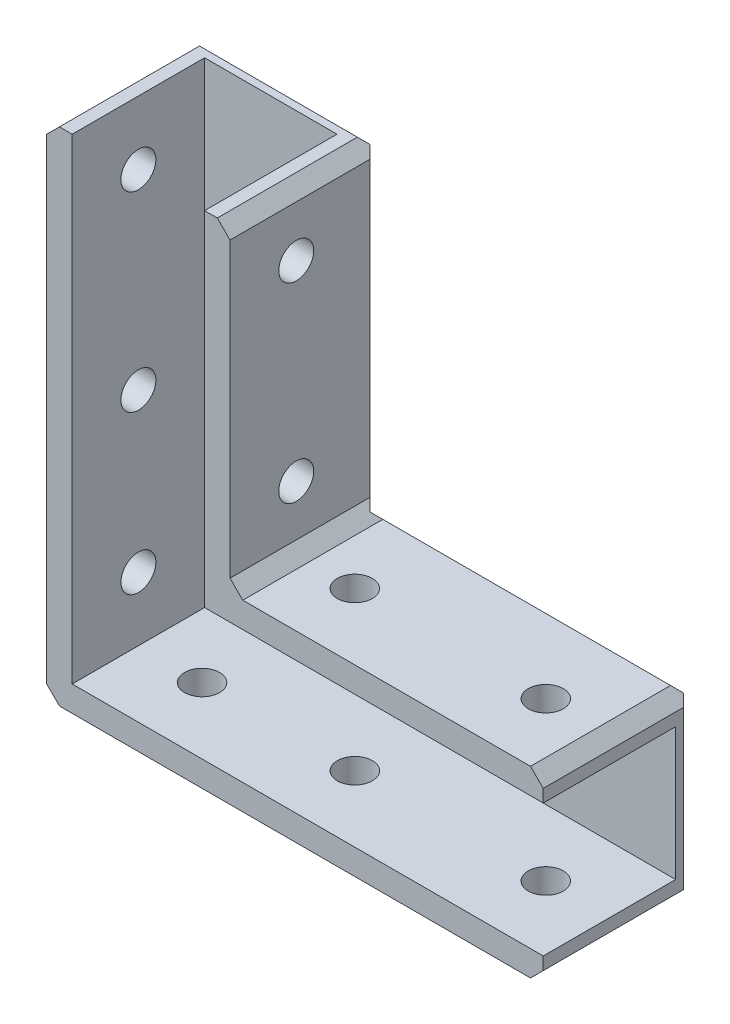
ISO-10303-21;
HEADER;
FILE_DESCRIPTION(('STEP AP214'),'2;1');
FILE_NAME('part.step','',(''),(''),'','','');
FILE_SCHEMA(('AUTOMOTIVE_DESIGN { 1 0 10303 214 1 1 1 1 }'));
ENDSEC;
DATA;
#1=APPLICATION_CONTEXT('core data for automotive mechanical design processes');
#2=APPLICATION_PROTOCOL_DEFINITION('international standard','automotive_design',2000,#1);
#3=PRODUCT_CONTEXT('',#1,'mechanical');
#4=PRODUCT('Part','Part','',(#3));
#5=PRODUCT_RELATED_PRODUCT_CATEGORY('part','',(#4));
#6=PRODUCT_DEFINITION_FORMATION('','',#4);
#7=PRODUCT_DEFINITION_CONTEXT('part definition',#1,'design');
#8=PRODUCT_DEFINITION('design','',#6,#7);
#9=PRODUCT_DEFINITION_SHAPE('','',#8);
#10=(LENGTH_UNIT() NAMED_UNIT(*) SI_UNIT(.MILLI.,.METRE.));
#11=(NAMED_UNIT(*) PLANE_ANGLE_UNIT() SI_UNIT($,.RADIAN.));
#12=(NAMED_UNIT(*) SI_UNIT($,.STERADIAN.) SOLID_ANGLE_UNIT());
#13=UNCERTAINTY_MEASURE_WITH_UNIT(LENGTH_MEASURE(1.E-05),#10,'distance_accuracy_value','');
#14=(GEOMETRIC_REPRESENTATION_CONTEXT(3) GLOBAL_UNCERTAINTY_ASSIGNED_CONTEXT((#13)) GLOBAL_UNIT_ASSIGNED_CONTEXT((#10,
#11,#12)) REPRESENTATION_CONTEXT('',''));
#15=CARTESIAN_POINT('',(0.,0.,0.));
#16=DIRECTION('',(0.,0.,1.));
#17=DIRECTION('',(1.,0.,0.));
#18=AXIS2_PLACEMENT_3D('',#15,#16,#17);
#19=CARTESIAN_POINT('',(0.,0.,24.));
#20=DIRECTION('',(0.,0.,1.));
#21=DIRECTION('',(1.,0.,0.));
#22=AXIS2_PLACEMENT_3D('',#19,#20,#21);
#23=PLANE('',#22);
#24=DIRECTION('',(0.,1.,0.));
#25=VECTOR('',#24,1.);
#26=CARTESIAN_POINT('',(28.8,0.,24.));
#27=LINE('',#26,#25);
#28=CARTESIAN_POINT('',(28.8,30.8,24.));
#29=VERTEX_POINT('',#28);
#30=CARTESIAN_POINT('',(28.8,76.8,24.));
#31=VERTEX_POINT('',#30);
#32=EDGE_CURVE('E247',#29,#31,#27,.T.);
#33=ORIENTED_EDGE('',*,*,#32,.T.);
#34=DIRECTION('',(-0.707106781186548,0.707106781186548,0.));
#35=VECTOR('',#34,1.);
#36=CARTESIAN_POINT('',(52.8,52.8,24.));
#37=LINE('',#36,#35);
#38=CARTESIAN_POINT('',(26.8,78.8,24.));
#39=VERTEX_POINT('',#38);
#40=EDGE_CURVE('E361',#31,#39,#37,.T.);
#41=ORIENTED_EDGE('',*,*,#40,.T.);
#42=DIRECTION('',(1.,0.,0.));
#43=VECTOR('',#42,1.);
#44=CARTESIAN_POINT('',(0.,78.8,24.));
#45=LINE('',#44,#43);
#46=CARTESIAN_POINT('',(24.8,78.8,24.));
#47=VERTEX_POINT('',#46);
#48=EDGE_CURVE('E250',#47,#39,#45,.T.);
#49=ORIENTED_EDGE('',*,*,#48,.F.);
#50=DIRECTION('',(0.,1.,0.));
#51=VECTOR('',#50,1.);
#52=CARTESIAN_POINT('',(24.8,24.8,24.));
#53=LINE('',#52,#51);
#54=CARTESIAN_POINT('',(24.8,24.8,24.));
#55=VERTEX_POINT('',#54);
#56=EDGE_CURVE('E222',#55,#47,#53,.T.);
#57=ORIENTED_EDGE('',*,*,#56,.F.);
#58=DIRECTION('',(-1.,0.,0.));
#59=VECTOR('',#58,1.);
#60=CARTESIAN_POINT('',(78.,24.8,24.));
#61=LINE('',#60,#59);
#62=CARTESIAN_POINT('',(78.,24.8,24.));
#63=VERTEX_POINT('',#62);
#64=EDGE_CURVE('E458',#63,#55,#61,.T.);
#65=ORIENTED_EDGE('',*,*,#64,.F.);
#66=DIRECTION('',(0.,1.,0.));
#67=VECTOR('',#66,1.);
#68=CARTESIAN_POINT('',(78.,0.,24.));
#69=LINE('',#68,#67);
#70=CARTESIAN_POINT('',(78.,26.8,24.));
#71=VERTEX_POINT('',#70);
#72=EDGE_CURVE('E241',#63,#71,#69,.T.);
#73=ORIENTED_EDGE('',*,*,#72,.T.);
#74=DIRECTION('',(-0.707106781186545,0.70710678118655,0.));
#75=VECTOR('',#74,1.);
#76=CARTESIAN_POINT('',(52.4000000000003,52.3999999999999,24.));
#77=LINE('',#76,#75);
#78=CARTESIAN_POINT('',(76.,28.8,24.));
#79=VERTEX_POINT('',#78);
#80=EDGE_CURVE('E359',#71,#79,#77,.T.);
#81=ORIENTED_EDGE('',*,*,#80,.T.);
#82=DIRECTION('',(1.,0.,0.));
#83=VECTOR('',#82,1.);
#84=CARTESIAN_POINT('',(0.,28.8,24.));
#85=LINE('',#84,#83);
#86=CARTESIAN_POINT('',(30.8,28.8,24.));
#87=VERTEX_POINT('',#86);
#88=EDGE_CURVE('E244',#87,#79,#85,.T.);
#89=ORIENTED_EDGE('',*,*,#88,.F.);
#90=DIRECTION('',(-0.707106781186543,0.707106781186552,0.));
#91=VECTOR('',#90,1.);
#92=CARTESIAN_POINT('',(28.8,30.8,24.));
#93=LINE('',#92,#91);
#94=EDGE_CURVE('E11',#87,#29,#93,.T.);
#95=ORIENTED_EDGE('',*,*,#94,.T.);
#96=EDGE_LOOP('',(#33,#41,#49,#57,#65,#73,#81,#89,#95));
#97=FACE_BOUND('',#96,.T.);
#98=ADVANCED_FACE('F37',(#97),#23,.T.);
#99=CARTESIAN_POINT('',(0.,0.,24.));
#100=DIRECTION('',(-1.,0.,0.));
#101=DIRECTION('',(0.,0.,1.));
#102=AXIS2_PLACEMENT_3D('',#99,#100,#101);
#103=PLANE('',#102);
#104=CARTESIAN_POINT('',(0.,14.,13.6));
#105=DIRECTION('',(-1.,0.,0.));
#106=DIRECTION('',(0.,0.,1.));
#107=AXIS2_PLACEMENT_3D('',#104,#105,#106);
#108=CIRCLE('',#107,2.75);
#109=CARTESIAN_POINT('',(0.,14.,16.35));
#110=VERTEX_POINT('',#109);
#111=EDGE_CURVE('E276',#110,#110,#108,.T.);
#112=ORIENTED_EDGE('',*,*,#111,.F.);
#113=EDGE_LOOP('',(#112));
#114=FACE_BOUND('',#113,.T.);
#115=CARTESIAN_POINT('',(0.,68.8,13.6));
#116=DIRECTION('',(-1.,0.,0.));
#117=DIRECTION('',(0.,0.,1.));
#118=AXIS2_PLACEMENT_3D('',#115,#116,#117);
#119=CIRCLE('',#118,2.75);
#120=CARTESIAN_POINT('',(0.,68.8,16.35));
#121=VERTEX_POINT('',#120);
#122=EDGE_CURVE('E503',#121,#121,#119,.T.);
#123=ORIENTED_EDGE('',*,*,#122,.F.);
#124=EDGE_LOOP('',(#123));
#125=FACE_BOUND('',#124,.T.);
#126=CARTESIAN_POINT('',(0.,38.8,13.6));
#127=DIRECTION('',(-1.,0.,0.));
#128=DIRECTION('',(0.,0.,1.));
#129=AXIS2_PLACEMENT_3D('',#126,#127,#128);
#130=CIRCLE('',#129,2.75);
#131=CARTESIAN_POINT('',(0.,38.8,16.35));
#132=VERTEX_POINT('',#131);
#133=EDGE_CURVE('E496',#132,#132,#130,.T.);
#134=ORIENTED_EDGE('',*,*,#133,.F.);
#135=EDGE_LOOP('',(#134));
#136=FACE_BOUND('',#135,.T.);
#137=DIRECTION('',(0.,-1.,0.));
#138=VECTOR('',#137,1.);
#139=CARTESIAN_POINT('',(0.,0.,2.00000000000002));
#140=LINE('',#139,#138);
#141=CARTESIAN_POINT('',(0.,76.8,2.00000000000002));
#142=VERTEX_POINT('',#141);
#143=CARTESIAN_POINT('',(0.,2.00000000000002,2.00000000000002));
#144=VERTEX_POINT('',#143);
#145=EDGE_CURVE('E299',#142,#144,#140,.T.);
#146=ORIENTED_EDGE('',*,*,#145,.T.);
#147=DIRECTION('',(0.,0.,1.));
#148=VECTOR('',#147,1.);
#149=CARTESIAN_POINT('',(0.,2.00000000000002,24.));
#150=LINE('',#149,#148);
#151=CARTESIAN_POINT('',(0.,2.00000000000002,24.));
#152=VERTEX_POINT('',#151);
#153=EDGE_CURVE('E337',#144,#152,#150,.T.);
#154=ORIENTED_EDGE('',*,*,#153,.T.);
#155=DIRECTION('',(0.,1.,0.));
#156=VECTOR('',#155,1.);
#157=CARTESIAN_POINT('',(0.,0.,24.));
#158=LINE('',#157,#156);
#159=CARTESIAN_POINT('',(0.,76.8,24.));
#160=VERTEX_POINT('',#159);
#161=EDGE_CURVE('E234',#152,#160,#158,.T.);
#162=ORIENTED_EDGE('',*,*,#161,.T.);
#163=DIRECTION('',(0.,0.,-1.));
#164=VECTOR('',#163,1.);
#165=CARTESIAN_POINT('',(0.,76.8,24.));
#166=LINE('',#165,#164);
#167=EDGE_CURVE('E334',#160,#142,#166,.T.);
#168=ORIENTED_EDGE('',*,*,#167,.T.);
#169=EDGE_LOOP('',(#146,#154,#162,#168));
#170=FACE_BOUND('',#169,.T.);
#171=ADVANCED_FACE('F520',(#114,#125,#136,#170),#103,.T.);
#172=CARTESIAN_POINT('',(0.,0.,24.));
#173=DIRECTION('',(0.,1.,0.));
#174=DIRECTION('',(0.,0.,1.));
#175=AXIS2_PLACEMENT_3D('',#172,#173,#174);
#176=PLANE('',#175);
#177=CARTESIAN_POINT('',(14.,0.,13.6));
#178=DIRECTION('',(0.,-1.,0.));
#179=DIRECTION('',(0.,0.,-1.));
#180=AXIS2_PLACEMENT_3D('',#177,#178,#179);
#181=CIRCLE('',#180,2.75);
#182=CARTESIAN_POINT('',(14.,0.,10.85));
#183=VERTEX_POINT('',#182);
#184=EDGE_CURVE('E280',#183,#183,#181,.T.);
#185=ORIENTED_EDGE('',*,*,#184,.F.);
#186=EDGE_LOOP('',(#185));
#187=FACE_BOUND('',#186,.T.);
#188=CARTESIAN_POINT('',(38.,0.,13.6));
#189=DIRECTION('',(0.,1.,0.));
#190=DIRECTION('',(0.,0.,1.));
#191=AXIS2_PLACEMENT_3D('',#188,#189,#190);
#192=CIRCLE('',#191,2.74999999999999);
#193=CARTESIAN_POINT('',(38.,0.,16.35));
#194=VERTEX_POINT('',#193);
#195=EDGE_CURVE('E489',#194,#194,#192,.T.);
#196=ORIENTED_EDGE('',*,*,#195,.T.);
#197=EDGE_LOOP('',(#196));
#198=FACE_BOUND('',#197,.T.);
#199=CARTESIAN_POINT('',(68.,0.,13.6));
#200=DIRECTION('',(0.,1.,0.));
#201=DIRECTION('',(0.,0.,1.));
#202=AXIS2_PLACEMENT_3D('',#199,#200,#201);
#203=CIRCLE('',#202,2.75000000000001);
#204=CARTESIAN_POINT('',(68.,0.,16.35));
#205=VERTEX_POINT('',#204);
#206=EDGE_CURVE('E478',#205,#205,#203,.T.);
#207=ORIENTED_EDGE('',*,*,#206,.T.);
#208=EDGE_LOOP('',(#207));
#209=FACE_BOUND('',#208,.T.);
#210=DIRECTION('',(1.,0.,0.));
#211=VECTOR('',#210,1.);
#212=CARTESIAN_POINT('',(0.,0.,24.));
#213=LINE('',#212,#211);
#214=CARTESIAN_POINT('',(2.00000000000002,0.,24.));
#215=VERTEX_POINT('',#214);
#216=CARTESIAN_POINT('',(76.,0.,24.));
#217=VERTEX_POINT('',#216);
#218=EDGE_CURVE('E237',#215,#217,#213,.T.);
#219=ORIENTED_EDGE('',*,*,#218,.F.);
#220=DIRECTION('',(0.,0.,-1.));
#221=VECTOR('',#220,1.);
#222=CARTESIAN_POINT('',(2.00000000000002,0.,2.00000000000002));
#223=LINE('',#222,#221);
#224=CARTESIAN_POINT('',(2.00000000000002,0.,2.00000000000002));
#225=VERTEX_POINT('',#224);
#226=EDGE_CURVE('E319',#215,#225,#223,.T.);
#227=ORIENTED_EDGE('',*,*,#226,.T.);
#228=DIRECTION('',(1.,0.,0.));
#229=VECTOR('',#228,1.);
#230=CARTESIAN_POINT('',(0.,0.,2.00000000000002));
#231=LINE('',#230,#229);
#232=CARTESIAN_POINT('',(76.,0.,2.00000000000002));
#233=VERTEX_POINT('',#232);
#234=EDGE_CURVE('E296',#225,#233,#231,.T.);
#235=ORIENTED_EDGE('',*,*,#234,.T.);
#236=DIRECTION('',(0.,0.,1.));
#237=VECTOR('',#236,1.);
#238=CARTESIAN_POINT('',(76.,0.,24.));
#239=LINE('',#238,#237);
#240=EDGE_CURVE('E317',#233,#217,#239,.T.);
#241=ORIENTED_EDGE('',*,*,#240,.T.);
#242=EDGE_LOOP('',(#219,#227,#235,#241));
#243=FACE_BOUND('',#242,.T.);
#244=ADVANCED_FACE('F400',(#187,#198,#209,#243),#176,.F.);
#245=CARTESIAN_POINT('',(78.,0.,24.));
#246=DIRECTION('',(-1.,0.,0.));
#247=DIRECTION('',(0.,0.,1.));
#248=AXIS2_PLACEMENT_3D('',#245,#246,#247);
#249=PLANE('',#248);
#250=DIRECTION('',(0.,1.,0.));
#251=VECTOR('',#250,1.);
#252=CARTESIAN_POINT('',(78.,0.,2.00000000000002));
#253=LINE('',#252,#251);
#254=CARTESIAN_POINT('',(78.,2.00000000000002,2.00000000000002));
#255=VERTEX_POINT('',#254);
#256=CARTESIAN_POINT('',(78.,26.8,2.00000000000002));
#257=VERTEX_POINT('',#256);
#258=EDGE_CURVE('E62',#255,#257,#253,.T.);
#259=ORIENTED_EDGE('',*,*,#258,.T.);
#260=DIRECTION('',(0.,0.,1.));
#261=VECTOR('',#260,1.);
#262=CARTESIAN_POINT('',(78.,26.8,24.));
#263=LINE('',#262,#261);
#264=EDGE_CURVE('E370',#257,#71,#263,.T.);
#265=ORIENTED_EDGE('',*,*,#264,.T.);
#266=ORIENTED_EDGE('',*,*,#72,.F.);
#267=DIRECTION('',(0.,0.,1.));
#268=VECTOR('',#267,1.);
#269=CARTESIAN_POINT('',(78.,24.8,3.2));
#270=LINE('',#269,#268);
#271=CARTESIAN_POINT('',(78.,24.8,3.2));
#272=VERTEX_POINT('',#271);
#273=EDGE_CURVE('E462',#272,#63,#270,.T.);
#274=ORIENTED_EDGE('',*,*,#273,.F.);
#275=DIRECTION('',(0.,1.,0.));
#276=VECTOR('',#275,1.);
#277=CARTESIAN_POINT('',(78.,4.,3.2));
#278=LINE('',#277,#276);
#279=CARTESIAN_POINT('',(78.,4.,3.2));
#280=VERTEX_POINT('',#279);
#281=EDGE_CURVE('E465',#280,#272,#278,.T.);
#282=ORIENTED_EDGE('',*,*,#281,.F.);
#283=DIRECTION('',(0.,0.,1.));
#284=VECTOR('',#283,1.);
#285=CARTESIAN_POINT('',(78.,4.,3.2));
#286=LINE('',#285,#284);
#287=CARTESIAN_POINT('',(78.,4.,24.));
#288=VERTEX_POINT('',#287);
#289=EDGE_CURVE('E228',#280,#288,#286,.T.);
#290=ORIENTED_EDGE('',*,*,#289,.T.);
#291=CARTESIAN_POINT('',(78.,2.00000000000002,24.));
#292=VERTEX_POINT('',#291);
#293=EDGE_CURVE('E242',#292,#288,#69,.T.);
#294=ORIENTED_EDGE('',*,*,#293,.F.);
#295=DIRECTION('',(0.,0.,-1.));
#296=VECTOR('',#295,1.);
#297=CARTESIAN_POINT('',(78.,2.00000000000002,24.));
#298=LINE('',#297,#296);
#299=EDGE_CURVE('E367',#292,#255,#298,.T.);
#300=ORIENTED_EDGE('',*,*,#299,.T.);
#301=EDGE_LOOP('',(#259,#265,#266,#274,#282,#290,#294,#300));
#302=FACE_BOUND('',#301,.T.);
#303=ADVANCED_FACE('F460',(#302),#249,.F.);
#304=CARTESIAN_POINT('',(0.,28.8,24.));
#305=DIRECTION('',(0.,1.,0.));
#306=DIRECTION('',(0.,0.,1.));
#307=AXIS2_PLACEMENT_3D('',#304,#305,#306);
#308=PLANE('',#307);
#309=CARTESIAN_POINT('',(38.,28.8,13.6));
#310=DIRECTION('',(0.,1.,0.));
#311=DIRECTION('',(0.,0.,1.));
#312=AXIS2_PLACEMENT_3D('',#309,#310,#311);
#313=CIRCLE('',#312,2.74999999999999);
#314=CARTESIAN_POINT('',(38.,28.8,16.35));
#315=VERTEX_POINT('',#314);
#316=EDGE_CURVE('E262',#315,#315,#313,.T.);
#317=ORIENTED_EDGE('',*,*,#316,.F.);
#318=EDGE_LOOP('',(#317));
#319=FACE_BOUND('',#318,.T.);
#320=CARTESIAN_POINT('',(68.,28.8,13.6));
#321=DIRECTION('',(0.,1.,0.));
#322=DIRECTION('',(0.,0.,1.));
#323=AXIS2_PLACEMENT_3D('',#320,#321,#322);
#324=CIRCLE('',#323,2.75000000000001);
#325=CARTESIAN_POINT('',(68.,28.8,16.35));
#326=VERTEX_POINT('',#325);
#327=EDGE_CURVE('E257',#326,#326,#324,.T.);
#328=ORIENTED_EDGE('',*,*,#327,.F.);
#329=EDGE_LOOP('',(#328));
#330=FACE_BOUND('',#329,.T.);
#331=DIRECTION('',(-1.,0.,0.));
#332=VECTOR('',#331,1.);
#333=CARTESIAN_POINT('',(28.8,28.8,2.00000000000002));
#334=LINE('',#333,#332);
#335=CARTESIAN_POINT('',(76.,28.8,2.00000000000002));
#336=VERTEX_POINT('',#335);
#337=CARTESIAN_POINT('',(30.8,28.8,2.00000000000002));
#338=VERTEX_POINT('',#337);
#339=EDGE_CURVE('E293',#336,#338,#334,.T.);
#340=ORIENTED_EDGE('',*,*,#339,.T.);
#341=DIRECTION('',(0.,0.,1.));
#342=VECTOR('',#341,1.);
#343=CARTESIAN_POINT('',(30.8,28.8,24.));
#344=LINE('',#343,#342);
#345=EDGE_CURVE('E315',#338,#87,#344,.T.);
#346=ORIENTED_EDGE('',*,*,#345,.T.);
#347=ORIENTED_EDGE('',*,*,#88,.T.);
#348=DIRECTION('',(0.,0.,-1.));
#349=VECTOR('',#348,1.);
#350=CARTESIAN_POINT('',(76.,28.8,2.00000000000002));
#351=LINE('',#350,#349);
#352=EDGE_CURVE('E312',#79,#336,#351,.T.);
#353=ORIENTED_EDGE('',*,*,#352,.T.);
#354=EDGE_LOOP('',(#340,#346,#347,#353));
#355=FACE_BOUND('',#354,.T.);
#356=ADVANCED_FACE('F448',(#319,#330,#355),#308,.T.);
#357=CARTESIAN_POINT('',(28.8,0.,24.));
#358=DIRECTION('',(-1.,0.,0.));
#359=DIRECTION('',(0.,0.,1.));
#360=AXIS2_PLACEMENT_3D('',#357,#358,#359);
#361=PLANE('',#360);
#362=CARTESIAN_POINT('',(28.8,68.8,13.6));
#363=DIRECTION('',(1.,0.,0.));
#364=DIRECTION('',(0.,0.,-1.));
#365=AXIS2_PLACEMENT_3D('',#362,#363,#364);
#366=CIRCLE('',#365,2.75);
#367=CARTESIAN_POINT('',(28.8,68.8,10.85));
#368=VERTEX_POINT('',#367);
#369=EDGE_CURVE('E272',#368,#368,#366,.T.);
#370=ORIENTED_EDGE('',*,*,#369,.F.);
#371=EDGE_LOOP('',(#370));
#372=FACE_BOUND('',#371,.T.);
#373=CARTESIAN_POINT('',(28.8,38.8,13.6));
#374=DIRECTION('',(1.,0.,0.));
#375=DIRECTION('',(0.,0.,-1.));
#376=AXIS2_PLACEMENT_3D('',#373,#374,#375);
#377=CIRCLE('',#376,2.75);
#378=CARTESIAN_POINT('',(28.8,38.8,10.85));
#379=VERTEX_POINT('',#378);
#380=EDGE_CURVE('E267',#379,#379,#377,.T.);
#381=ORIENTED_EDGE('',*,*,#380,.F.);
#382=EDGE_LOOP('',(#381));
#383=FACE_BOUND('',#382,.T.);
#384=ORIENTED_EDGE('',*,*,#32,.F.);
#385=DIRECTION('',(0.,0.,-1.));
#386=VECTOR('',#385,1.);
#387=CARTESIAN_POINT('',(28.8,30.8,24.));
#388=LINE('',#387,#386);
#389=CARTESIAN_POINT('',(28.8,30.8,2.00000000000002));
#390=VERTEX_POINT('',#389);
#391=EDGE_CURVE('E309',#29,#390,#388,.T.);
#392=ORIENTED_EDGE('',*,*,#391,.T.);
#393=DIRECTION('',(0.,1.,0.));
#394=VECTOR('',#393,1.);
#395=CARTESIAN_POINT('',(28.8,0.,2.00000000000002));
#396=LINE('',#395,#394);
#397=CARTESIAN_POINT('',(28.8,76.8,2.00000000000002));
#398=VERTEX_POINT('',#397);
#399=EDGE_CURVE('E252',#390,#398,#396,.T.);
#400=ORIENTED_EDGE('',*,*,#399,.T.);
#401=DIRECTION('',(0.,0.,1.));
#402=VECTOR('',#401,1.);
#403=CARTESIAN_POINT('',(28.8,76.8,24.));
#404=LINE('',#403,#402);
#405=EDGE_CURVE('E302',#398,#31,#404,.T.);
#406=ORIENTED_EDGE('',*,*,#405,.T.);
#407=EDGE_LOOP('',(#384,#392,#400,#406));
#408=FACE_BOUND('',#407,.T.);
#409=ADVANCED_FACE('F434',(#372,#383,#408),#361,.F.);
#410=CARTESIAN_POINT('',(0.,78.8,24.));
#411=DIRECTION('',(0.,1.,0.));
#412=DIRECTION('',(0.,0.,1.));
#413=AXIS2_PLACEMENT_3D('',#410,#411,#412);
#414=PLANE('',#413);
#415=DIRECTION('',(-1.,0.,0.));
#416=VECTOR('',#415,1.);
#417=CARTESIAN_POINT('',(2.00000000000002,78.8,2.00000000000002));
#418=LINE('',#417,#416);
#419=CARTESIAN_POINT('',(26.8,78.8,2.00000000000002));
#420=VERTEX_POINT('',#419);
#421=CARTESIAN_POINT('',(2.00000000000002,78.8,2.00000000000002));
#422=VERTEX_POINT('',#421);
#423=EDGE_CURVE('E347',#420,#422,#418,.T.);
#424=ORIENTED_EDGE('',*,*,#423,.T.);
#425=DIRECTION('',(0.,0.,1.));
#426=VECTOR('',#425,1.);
#427=CARTESIAN_POINT('',(2.00000000000002,78.8,24.));
#428=LINE('',#427,#426);
#429=CARTESIAN_POINT('',(2.00000000000002,78.8,24.));
#430=VERTEX_POINT('',#429);
#431=EDGE_CURVE('E349',#422,#430,#428,.T.);
#432=ORIENTED_EDGE('',*,*,#431,.T.);
#433=CARTESIAN_POINT('',(4.,78.8,24.));
#434=VERTEX_POINT('',#433);
#435=EDGE_CURVE('E226',#430,#434,#45,.T.);
#436=ORIENTED_EDGE('',*,*,#435,.T.);
#437=DIRECTION('',(0.,0.,1.));
#438=VECTOR('',#437,1.);
#439=CARTESIAN_POINT('',(4.,78.8,3.2));
#440=LINE('',#439,#438);
#441=CARTESIAN_POINT('',(4.,78.8,3.2));
#442=VERTEX_POINT('',#441);
#443=EDGE_CURVE('E205',#442,#434,#440,.T.);
#444=ORIENTED_EDGE('',*,*,#443,.F.);
#445=DIRECTION('',(-1.,0.,0.));
#446=VECTOR('',#445,1.);
#447=CARTESIAN_POINT('',(4.,78.8,3.2));
#448=LINE('',#447,#446);
#449=CARTESIAN_POINT('',(24.8,78.8,3.2));
#450=VERTEX_POINT('',#449);
#451=EDGE_CURVE('E212',#450,#442,#448,.T.);
#452=ORIENTED_EDGE('',*,*,#451,.F.);
#453=DIRECTION('',(0.,0.,1.));
#454=VECTOR('',#453,1.);
#455=CARTESIAN_POINT('',(24.8,78.8,3.2));
#456=LINE('',#455,#454);
#457=EDGE_CURVE('E238',#450,#47,#456,.T.);
#458=ORIENTED_EDGE('',*,*,#457,.T.);
#459=ORIENTED_EDGE('',*,*,#48,.T.);
#460=DIRECTION('',(0.,0.,-1.));
#461=VECTOR('',#460,1.);
#462=CARTESIAN_POINT('',(26.8,78.8,2.00000000000002));
#463=LINE('',#462,#461);
#464=EDGE_CURVE('E345',#39,#420,#463,.T.);
#465=ORIENTED_EDGE('',*,*,#464,.T.);
#466=EDGE_LOOP('',(#424,#432,#436,#444,#452,#458,#459,#465));
#467=FACE_BOUND('',#466,.T.);
#468=ADVANCED_FACE('F224',(#467),#414,.T.);
#469=ORIENTED_EDGE('',*,*,#161,.F.);
#470=DIRECTION('',(0.707106781186548,-0.707106781186548,0.));
#471=VECTOR('',#470,1.);
#472=CARTESIAN_POINT('',(1.00000000000001,1.00000000000001,24.));
#473=LINE('',#472,#471);
#474=EDGE_CURVE('E343',#152,#215,#473,.T.);
#475=ORIENTED_EDGE('',*,*,#474,.T.);
#476=ORIENTED_EDGE('',*,*,#218,.T.);
#477=DIRECTION('',(-0.707106781186548,-0.707106781186548,0.));
#478=VECTOR('',#477,1.);
#479=CARTESIAN_POINT('',(38.,-38.,24.));
#480=LINE('',#479,#478);
#481=EDGE_CURVE('E339',#217,#292,#480,.F.);
#482=ORIENTED_EDGE('',*,*,#481,.T.);
#483=ORIENTED_EDGE('',*,*,#293,.T.);
#484=DIRECTION('',(1.,0.,0.));
#485=VECTOR('',#484,1.);
#486=CARTESIAN_POINT('',(4.00000000000001,4.,24.));
#487=LINE('',#486,#485);
#488=CARTESIAN_POINT('',(4.00000000000001,4.,24.));
#489=VERTEX_POINT('',#488);
#490=EDGE_CURVE('E474',#489,#288,#487,.T.);
#491=ORIENTED_EDGE('',*,*,#490,.F.);
#492=DIRECTION('',(0.,-1.,0.));
#493=VECTOR('',#492,1.);
#494=CARTESIAN_POINT('',(4.,78.8,24.));
#495=LINE('',#494,#493);
#496=EDGE_CURVE('E477',#434,#489,#495,.T.);
#497=ORIENTED_EDGE('',*,*,#496,.F.);
#498=ORIENTED_EDGE('',*,*,#435,.F.);
#499=DIRECTION('',(0.70710678118655,0.707106781186545,0.));
#500=VECTOR('',#499,1.);
#501=CARTESIAN_POINT('',(-38.4,38.4000000000003,24.));
#502=LINE('',#501,#500);
#503=EDGE_CURVE('E341',#430,#160,#502,.F.);
#504=ORIENTED_EDGE('',*,*,#503,.T.);
#505=EDGE_LOOP('',(#469,#475,#476,#482,#483,#491,#497,#498,#504));
#506=FACE_BOUND('',#505,.T.);
#507=ADVANCED_FACE('F542',(#506),#23,.T.);
#508=CARTESIAN_POINT('',(0.,0.,0.));
#509=DIRECTION('',(0.,0.,1.));
#510=DIRECTION('',(1.,0.,0.));
#511=AXIS2_PLACEMENT_3D('',#508,#509,#510);
#512=PLANE('',#511);
#513=DIRECTION('',(0.,1.,0.));
#514=VECTOR('',#513,1.);
#515=CARTESIAN_POINT('',(2.00000000000002,78.8,0.));
#516=LINE('',#515,#514);
#517=CARTESIAN_POINT('',(2.00000000000002,2.00000000000002,0.));
#518=VERTEX_POINT('',#517);
#519=CARTESIAN_POINT('',(2.00000000000002,76.8,0.));
#520=VERTEX_POINT('',#519);
#521=EDGE_CURVE('E283',#518,#520,#516,.T.);
#522=ORIENTED_EDGE('',*,*,#521,.T.);
#523=DIRECTION('',(1.,0.,0.));
#524=VECTOR('',#523,1.);
#525=CARTESIAN_POINT('',(26.8,76.8,0.));
#526=LINE('',#525,#524);
#527=CARTESIAN_POINT('',(26.8,76.8,0.));
#528=VERTEX_POINT('',#527);
#529=EDGE_CURVE('E353',#520,#528,#526,.T.);
#530=ORIENTED_EDGE('',*,*,#529,.T.);
#531=DIRECTION('',(0.,-1.,0.));
#532=VECTOR('',#531,1.);
#533=CARTESIAN_POINT('',(26.8,0.,0.));
#534=LINE('',#533,#532);
#535=CARTESIAN_POINT('',(26.8,26.8,0.));
#536=VERTEX_POINT('',#535);
#537=EDGE_CURVE('E291',#528,#536,#534,.T.);
#538=ORIENTED_EDGE('',*,*,#537,.T.);
#539=DIRECTION('',(1.,0.,0.));
#540=VECTOR('',#539,1.);
#541=CARTESIAN_POINT('',(78.,26.8,0.));
#542=LINE('',#541,#540);
#543=CARTESIAN_POINT('',(76.,26.8,0.));
#544=VERTEX_POINT('',#543);
#545=EDGE_CURVE('E288',#536,#544,#542,.T.);
#546=ORIENTED_EDGE('',*,*,#545,.T.);
#547=DIRECTION('',(0.,-1.,0.));
#548=VECTOR('',#547,1.);
#549=CARTESIAN_POINT('',(76.,0.,0.));
#550=LINE('',#549,#548);
#551=CARTESIAN_POINT('',(76.,2.00000000000002,0.));
#552=VERTEX_POINT('',#551);
#553=EDGE_CURVE('E351',#544,#552,#550,.T.);
#554=ORIENTED_EDGE('',*,*,#553,.T.);
#555=DIRECTION('',(-1.,0.,0.));
#556=VECTOR('',#555,1.);
#557=CARTESIAN_POINT('',(0.,2.00000000000002,0.));
#558=LINE('',#557,#556);
#559=EDGE_CURVE('E286',#552,#518,#558,.T.);
#560=ORIENTED_EDGE('',*,*,#559,.T.);
#561=EDGE_LOOP('',(#522,#530,#538,#546,#554,#560));
#562=FACE_BOUND('',#561,.T.);
#563=ADVANCED_FACE('F415',(#562),#512,.F.);
#564=CARTESIAN_POINT('',(24.8,24.8,3.2));
#565=DIRECTION('',(1.,0.,0.));
#566=DIRECTION('',(0.,0.,-1.));
#567=AXIS2_PLACEMENT_3D('',#564,#565,#566);
#568=PLANE('',#567);
#569=CARTESIAN_POINT('',(24.8,68.8,13.6));
#570=DIRECTION('',(1.,0.,0.));
#571=DIRECTION('',(0.,0.,-1.));
#572=AXIS2_PLACEMENT_3D('',#569,#570,#571);
#573=CIRCLE('',#572,2.75);
#574=CARTESIAN_POINT('',(24.8,68.8,10.85));
#575=VERTEX_POINT('',#574);
#576=EDGE_CURVE('E271',#575,#575,#573,.T.);
#577=ORIENTED_EDGE('',*,*,#576,.T.);
#578=EDGE_LOOP('',(#577));
#579=FACE_BOUND('',#578,.T.);
#580=CARTESIAN_POINT('',(24.8,38.8,13.6));
#581=DIRECTION('',(1.,0.,0.));
#582=DIRECTION('',(0.,0.,-1.));
#583=AXIS2_PLACEMENT_3D('',#580,#581,#582);
#584=CIRCLE('',#583,2.75);
#585=CARTESIAN_POINT('',(24.8,38.8,10.85));
#586=VERTEX_POINT('',#585);
#587=EDGE_CURVE('E266',#586,#586,#584,.T.);
#588=ORIENTED_EDGE('',*,*,#587,.T.);
#589=EDGE_LOOP('',(#588));
#590=FACE_BOUND('',#589,.T.);
#591=ORIENTED_EDGE('',*,*,#56,.T.);
#592=ORIENTED_EDGE('',*,*,#457,.F.);
#593=DIRECTION('',(0.,1.,0.));
#594=VECTOR('',#593,1.);
#595=CARTESIAN_POINT('',(24.8,24.8,3.2));
#596=LINE('',#595,#594);
#597=CARTESIAN_POINT('',(24.8,24.8,3.2));
#598=VERTEX_POINT('',#597);
#599=EDGE_CURVE('E219',#598,#450,#596,.T.);
#600=ORIENTED_EDGE('',*,*,#599,.F.);
#601=DIRECTION('',(0.,0.,1.));
#602=VECTOR('',#601,1.);
#603=CARTESIAN_POINT('',(24.8,24.8,3.2));
#604=LINE('',#603,#602);
#605=EDGE_CURVE('E467',#598,#55,#604,.T.);
#606=ORIENTED_EDGE('',*,*,#605,.T.);
#607=EDGE_LOOP('',(#591,#592,#600,#606));
#608=FACE_BOUND('',#607,.T.);
#609=ADVANCED_FACE('F556',(#579,#590,#608),#568,.F.);
#610=CARTESIAN_POINT('',(78.,24.8,3.2));
#611=DIRECTION('',(0.,1.,0.));
#612=DIRECTION('',(-1.,0.,0.));
#613=AXIS2_PLACEMENT_3D('',#610,#611,#612);
#614=PLANE('',#613);
#615=CARTESIAN_POINT('',(38.,24.8,13.6));
#616=DIRECTION('',(0.,1.,0.));
#617=DIRECTION('',(-1.,0.,0.));
#618=AXIS2_PLACEMENT_3D('',#615,#616,#617);
#619=CIRCLE('',#618,2.74999999999999);
#620=CARTESIAN_POINT('',(35.25,24.8,13.6));
#621=VERTEX_POINT('',#620);
#622=EDGE_CURVE('E261',#621,#621,#619,.T.);
#623=ORIENTED_EDGE('',*,*,#622,.T.);
#624=EDGE_LOOP('',(#623));
#625=FACE_BOUND('',#624,.T.);
#626=CARTESIAN_POINT('',(68.,24.8,13.6));
#627=DIRECTION('',(0.,1.,0.));
#628=DIRECTION('',(-1.,0.,0.));
#629=AXIS2_PLACEMENT_3D('',#626,#627,#628);
#630=CIRCLE('',#629,2.75000000000001);
#631=CARTESIAN_POINT('',(65.25,24.8,13.6));
#632=VERTEX_POINT('',#631);
#633=EDGE_CURVE('E256',#632,#632,#630,.T.);
#634=ORIENTED_EDGE('',*,*,#633,.T.);
#635=EDGE_LOOP('',(#634));
#636=FACE_BOUND('',#635,.T.);
#637=ORIENTED_EDGE('',*,*,#64,.T.);
#638=ORIENTED_EDGE('',*,*,#605,.F.);
#639=DIRECTION('',(-1.,0.,0.));
#640=VECTOR('',#639,1.);
#641=CARTESIAN_POINT('',(78.,24.8,3.2));
#642=LINE('',#641,#640);
#643=EDGE_CURVE('E230',#272,#598,#642,.T.);
#644=ORIENTED_EDGE('',*,*,#643,.F.);
#645=ORIENTED_EDGE('',*,*,#273,.T.);
#646=EDGE_LOOP('',(#637,#638,#644,#645));
#647=FACE_BOUND('',#646,.T.);
#648=ADVANCED_FACE('F566',(#625,#636,#647),#614,.F.);
#649=CARTESIAN_POINT('',(4.00000000000001,4.,3.2));
#650=DIRECTION('',(0.,-1.,0.));
#651=DIRECTION('',(0.,0.,-1.));
#652=AXIS2_PLACEMENT_3D('',#649,#650,#651);
#653=PLANE('',#652);
#654=CARTESIAN_POINT('',(14.,4.,13.6));
#655=DIRECTION('',(0.,-1.,0.));
#656=DIRECTION('',(0.,0.,-1.));
#657=AXIS2_PLACEMENT_3D('',#654,#655,#656);
#658=CIRCLE('',#657,2.75);
#659=CARTESIAN_POINT('',(14.,4.,10.85));
#660=VERTEX_POINT('',#659);
#661=EDGE_CURVE('E277',#660,#660,#658,.T.);
#662=ORIENTED_EDGE('',*,*,#661,.T.);
#663=EDGE_LOOP('',(#662));
#664=FACE_BOUND('',#663,.T.);
#665=CARTESIAN_POINT('',(38.,4.,13.6));
#666=DIRECTION('',(0.,-1.,0.));
#667=DIRECTION('',(0.,0.,-1.));
#668=AXIS2_PLACEMENT_3D('',#665,#666,#667);
#669=CIRCLE('',#668,2.74999999999999);
#670=CARTESIAN_POINT('',(38.,4.,10.85));
#671=VERTEX_POINT('',#670);
#672=EDGE_CURVE('E258',#671,#671,#669,.T.);
#673=ORIENTED_EDGE('',*,*,#672,.T.);
#674=EDGE_LOOP('',(#673));
#675=FACE_BOUND('',#674,.T.);
#676=CARTESIAN_POINT('',(68.,4.,13.6));
#677=DIRECTION('',(0.,-1.,0.));
#678=DIRECTION('',(0.,0.,-1.));
#679=AXIS2_PLACEMENT_3D('',#676,#677,#678);
#680=CIRCLE('',#679,2.75000000000001);
#681=CARTESIAN_POINT('',(68.,4.,10.85));
#682=VERTEX_POINT('',#681);
#683=EDGE_CURVE('E253',#682,#682,#680,.T.);
#684=ORIENTED_EDGE('',*,*,#683,.T.);
#685=EDGE_LOOP('',(#684));
#686=FACE_BOUND('',#685,.T.);
#687=ORIENTED_EDGE('',*,*,#490,.T.);
#688=ORIENTED_EDGE('',*,*,#289,.F.);
#689=DIRECTION('',(1.,0.,0.));
#690=VECTOR('',#689,1.);
#691=CARTESIAN_POINT('',(4.00000000000001,4.,3.2));
#692=LINE('',#691,#690);
#693=CARTESIAN_POINT('',(4.00000000000001,4.,3.2));
#694=VERTEX_POINT('',#693);
#695=EDGE_CURVE('E211',#694,#280,#692,.T.);
#696=ORIENTED_EDGE('',*,*,#695,.F.);
#697=DIRECTION('',(0.,0.,1.));
#698=VECTOR('',#697,1.);
#699=CARTESIAN_POINT('',(4.00000000000001,4.,3.2));
#700=LINE('',#699,#698);
#701=EDGE_CURVE('E207',#694,#489,#700,.T.);
#702=ORIENTED_EDGE('',*,*,#701,.T.);
#703=EDGE_LOOP('',(#687,#688,#696,#702));
#704=FACE_BOUND('',#703,.T.);
#705=ADVANCED_FACE('F568',(#664,#675,#686,#704),#653,.F.);
#706=CARTESIAN_POINT('',(4.,78.8,3.2));
#707=DIRECTION('',(-1.,0.,0.));
#708=DIRECTION('',(0.,-1.,0.));
#709=AXIS2_PLACEMENT_3D('',#706,#707,#708);
#710=PLANE('',#709);
#711=CARTESIAN_POINT('',(4.00000000000001,14.,13.6));
#712=DIRECTION('',(-1.,0.,0.));
#713=DIRECTION('',(0.,-1.,0.));
#714=AXIS2_PLACEMENT_3D('',#711,#712,#713);
#715=CIRCLE('',#714,2.75);
#716=CARTESIAN_POINT('',(4.00000000000001,11.25,13.6));
#717=VERTEX_POINT('',#716);
#718=EDGE_CURVE('E273',#717,#717,#715,.T.);
#719=ORIENTED_EDGE('',*,*,#718,.T.);
#720=EDGE_LOOP('',(#719));
#721=FACE_BOUND('',#720,.T.);
#722=CARTESIAN_POINT('',(4.,68.8,13.6));
#723=DIRECTION('',(-1.,0.,0.));
#724=DIRECTION('',(0.,-1.,0.));
#725=AXIS2_PLACEMENT_3D('',#722,#723,#724);
#726=CIRCLE('',#725,2.75);
#727=CARTESIAN_POINT('',(4.,66.05,13.6));
#728=VERTEX_POINT('',#727);
#729=EDGE_CURVE('E268',#728,#728,#726,.T.);
#730=ORIENTED_EDGE('',*,*,#729,.T.);
#731=EDGE_LOOP('',(#730));
#732=FACE_BOUND('',#731,.T.);
#733=CARTESIAN_POINT('',(4.,38.8,13.6));
#734=DIRECTION('',(-1.,0.,0.));
#735=DIRECTION('',(0.,-1.,0.));
#736=AXIS2_PLACEMENT_3D('',#733,#734,#735);
#737=CIRCLE('',#736,2.75);
#738=CARTESIAN_POINT('',(4.,36.05,13.6));
#739=VERTEX_POINT('',#738);
#740=EDGE_CURVE('E263',#739,#739,#737,.T.);
#741=ORIENTED_EDGE('',*,*,#740,.T.);
#742=EDGE_LOOP('',(#741));
#743=FACE_BOUND('',#742,.T.);
#744=ORIENTED_EDGE('',*,*,#496,.T.);
#745=ORIENTED_EDGE('',*,*,#701,.F.);
#746=DIRECTION('',(0.,-1.,0.));
#747=VECTOR('',#746,1.);
#748=CARTESIAN_POINT('',(4.,78.8,3.2));
#749=LINE('',#748,#747);
#750=EDGE_CURVE('E200',#442,#694,#749,.T.);
#751=ORIENTED_EDGE('',*,*,#750,.F.);
#752=ORIENTED_EDGE('',*,*,#443,.T.);
#753=EDGE_LOOP('',(#744,#745,#751,#752));
#754=FACE_BOUND('',#753,.T.);
#755=ADVANCED_FACE('F203',(#721,#732,#743,#754),#710,.F.);
#756=CARTESIAN_POINT('',(0.,0.,3.2));
#757=DIRECTION('',(0.,0.,1.));
#758=DIRECTION('',(1.,0.,0.));
#759=AXIS2_PLACEMENT_3D('',#756,#757,#758);
#760=PLANE('',#759);
#761=ORIENTED_EDGE('',*,*,#451,.T.);
#762=ORIENTED_EDGE('',*,*,#750,.T.);
#763=ORIENTED_EDGE('',*,*,#695,.T.);
#764=ORIENTED_EDGE('',*,*,#281,.T.);
#765=ORIENTED_EDGE('',*,*,#643,.T.);
#766=ORIENTED_EDGE('',*,*,#599,.T.);
#767=EDGE_LOOP('',(#761,#762,#763,#764,#765,#766));
#768=FACE_BOUND('',#767,.T.);
#769=ADVANCED_FACE('F216',(#768),#760,.T.);
#770=CARTESIAN_POINT('',(68.,-2.58927111120218,13.6));
#771=DIRECTION('',(0.,1.,0.));
#772=DIRECTION('',(0.,0.,1.));
#773=AXIS2_PLACEMENT_3D('',#770,#771,#772);
#774=CYLINDRICAL_SURFACE('',#773,2.75000000000001);
#775=ORIENTED_EDGE('',*,*,#683,.F.);
#776=EDGE_LOOP('',(#775));
#777=FACE_BOUND('',#776,.T.);
#778=ORIENTED_EDGE('',*,*,#206,.F.);
#779=EDGE_LOOP('',(#778));
#780=FACE_BOUND('',#779,.T.);
#781=ADVANCED_FACE('F526',(#777,#780),#774,.F.);
#782=ORIENTED_EDGE('',*,*,#327,.T.);
#783=EDGE_LOOP('',(#782));
#784=FACE_BOUND('',#783,.T.);
#785=ORIENTED_EDGE('',*,*,#633,.F.);
#786=EDGE_LOOP('',(#785));
#787=FACE_BOUND('',#786,.T.);
#788=ADVANCED_FACE('F528',(#784,#787),#774,.F.);
#789=CARTESIAN_POINT('',(38.,-2.58927111120218,13.6));
#790=DIRECTION('',(0.,1.,0.));
#791=DIRECTION('',(0.,0.,1.));
#792=AXIS2_PLACEMENT_3D('',#789,#790,#791);
#793=CYLINDRICAL_SURFACE('',#792,2.74999999999999);
#794=ORIENTED_EDGE('',*,*,#672,.F.);
#795=EDGE_LOOP('',(#794));
#796=FACE_BOUND('',#795,.T.);
#797=ORIENTED_EDGE('',*,*,#195,.F.);
#798=EDGE_LOOP('',(#797));
#799=FACE_BOUND('',#798,.T.);
#800=ADVANCED_FACE('F535',(#796,#799),#793,.F.);
#801=ORIENTED_EDGE('',*,*,#316,.T.);
#802=EDGE_LOOP('',(#801));
#803=FACE_BOUND('',#802,.T.);
#804=ORIENTED_EDGE('',*,*,#622,.F.);
#805=EDGE_LOOP('',(#804));
#806=FACE_BOUND('',#805,.T.);
#807=ADVANCED_FACE('F593',(#803,#806),#793,.F.);
#808=CARTESIAN_POINT('',(-2.58927111120218,38.8,13.6));
#809=DIRECTION('',(1.,0.,0.));
#810=DIRECTION('',(0.,0.,-1.));
#811=AXIS2_PLACEMENT_3D('',#808,#809,#810);
#812=CYLINDRICAL_SURFACE('',#811,2.75);
#813=ORIENTED_EDGE('',*,*,#133,.T.);
#814=EDGE_LOOP('',(#813));
#815=FACE_BOUND('',#814,.T.);
#816=ORIENTED_EDGE('',*,*,#740,.F.);
#817=EDGE_LOOP('',(#816));
#818=FACE_BOUND('',#817,.T.);
#819=ADVANCED_FACE('F590',(#815,#818),#812,.F.);
#820=ORIENTED_EDGE('',*,*,#380,.T.);
#821=EDGE_LOOP('',(#820));
#822=FACE_BOUND('',#821,.T.);
#823=ORIENTED_EDGE('',*,*,#587,.F.);
#824=EDGE_LOOP('',(#823));
#825=FACE_BOUND('',#824,.T.);
#826=ADVANCED_FACE('F592',(#822,#825),#812,.F.);
#827=CARTESIAN_POINT('',(-2.58927111120218,68.8,13.6));
#828=DIRECTION('',(1.,0.,0.));
#829=DIRECTION('',(0.,0.,-1.));
#830=AXIS2_PLACEMENT_3D('',#827,#828,#829);
#831=CYLINDRICAL_SURFACE('',#830,2.75);
#832=ORIENTED_EDGE('',*,*,#122,.T.);
#833=EDGE_LOOP('',(#832));
#834=FACE_BOUND('',#833,.T.);
#835=ORIENTED_EDGE('',*,*,#729,.F.);
#836=EDGE_LOOP('',(#835));
#837=FACE_BOUND('',#836,.T.);
#838=ADVANCED_FACE('F600',(#834,#837),#831,.F.);
#839=ORIENTED_EDGE('',*,*,#369,.T.);
#840=EDGE_LOOP('',(#839));
#841=FACE_BOUND('',#840,.T.);
#842=ORIENTED_EDGE('',*,*,#576,.F.);
#843=EDGE_LOOP('',(#842));
#844=FACE_BOUND('',#843,.T.);
#845=ADVANCED_FACE('F604',(#841,#844),#831,.F.);
#846=CARTESIAN_POINT('',(31.3892711112022,14.,13.6));
#847=DIRECTION('',(-1.,0.,0.));
#848=DIRECTION('',(0.,0.,1.));
#849=AXIS2_PLACEMENT_3D('',#846,#847,#848);
#850=CYLINDRICAL_SURFACE('',#849,2.75);
#851=ORIENTED_EDGE('',*,*,#111,.T.);
#852=EDGE_LOOP('',(#851));
#853=FACE_BOUND('',#852,.T.);
#854=ORIENTED_EDGE('',*,*,#718,.F.);
#855=EDGE_LOOP('',(#854));
#856=FACE_BOUND('',#855,.T.);
#857=ADVANCED_FACE('F657',(#853,#856),#850,.F.);
#858=CARTESIAN_POINT('',(14.,31.3892711112022,13.6));
#859=DIRECTION('',(0.,-1.,0.));
#860=DIRECTION('',(0.,0.,-1.));
#861=AXIS2_PLACEMENT_3D('',#858,#859,#860);
#862=CYLINDRICAL_SURFACE('',#861,2.75);
#863=ORIENTED_EDGE('',*,*,#184,.T.);
#864=EDGE_LOOP('',(#863));
#865=FACE_BOUND('',#864,.T.);
#866=ORIENTED_EDGE('',*,*,#661,.F.);
#867=EDGE_LOOP('',(#866));
#868=FACE_BOUND('',#867,.T.);
#869=ADVANCED_FACE('F515',(#865,#868),#862,.F.);
#870=CARTESIAN_POINT('',(0.,26.8,0.));
#871=DIRECTION('',(0.,0.707106781186547,-0.707106781186547));
#872=DIRECTION('',(-1.,0.,0.));
#873=AXIS2_PLACEMENT_3D('',#870,#871,#872);
#874=PLANE('',#873);
#875=ORIENTED_EDGE('',*,*,#339,.F.);
#876=DIRECTION('',(0.577350269189623,-0.577350269189627,-0.577350269189627));
#877=VECTOR('',#876,1.);
#878=CARTESIAN_POINT('',(52.0000000000002,52.7999999999999,25.9999999999999));
#879=LINE('',#878,#877);
#880=CARTESIAN_POINT('',(77.,27.8,1.));
#881=VERTEX_POINT('',#880);
#882=EDGE_CURVE('E365',#336,#881,#879,.T.);
#883=ORIENTED_EDGE('',*,*,#882,.T.);
#884=DIRECTION('',(0.577350269189626,0.577350269189626,0.577350269189626));
#885=VECTOR('',#884,1.);
#886=CARTESIAN_POINT('',(50.6666666666667,1.46666666666665,-25.3333333333333));
#887=LINE('',#886,#885);
#888=EDGE_CURVE('E363',#881,#544,#887,.F.);
#889=ORIENTED_EDGE('',*,*,#888,.T.);
#890=ORIENTED_EDGE('',*,*,#545,.F.);
#891=DIRECTION('',(-0.577350269189626,-0.577350269189626,-0.577350269189626));
#892=VECTOR('',#891,1.);
#893=CARTESIAN_POINT('',(19.2,19.2,-7.59999999999999));
#894=LINE('',#893,#892);
#895=CARTESIAN_POINT('',(29.8,29.8,3.00000000000002));
#896=VERTEX_POINT('',#895);
#897=EDGE_CURVE('E54',#896,#536,#894,.T.);
#898=ORIENTED_EDGE('',*,*,#897,.F.);
#899=DIRECTION('',(0.57735026918962,-0.577350269189629,-0.577350269189629));
#900=VECTOR('',#899,1.);
#901=CARTESIAN_POINT('',(22.1333333333334,37.4666666666667,10.6666666666668));
#902=LINE('',#901,#900);
#903=EDGE_CURVE('E46',#896,#338,#902,.T.);
#904=ORIENTED_EDGE('',*,*,#903,.T.);
#905=EDGE_LOOP('',(#875,#883,#889,#890,#898,#904));
#906=FACE_BOUND('',#905,.T.);
#907=ADVANCED_FACE('F446',(#906),#874,.T.);
#908=CARTESIAN_POINT('',(28.8,0.,2.00000000000002));
#909=DIRECTION('',(-0.707106781186547,0.,0.707106781186547));
#910=DIRECTION('',(0.,1.,0.));
#911=AXIS2_PLACEMENT_3D('',#908,#909,#910);
#912=PLANE('',#911);
#913=ORIENTED_EDGE('',*,*,#537,.F.);
#914=DIRECTION('',(-0.577350269189627,-0.577350269189623,-0.577350269189627));
#915=VECTOR('',#914,1.);
#916=CARTESIAN_POINT('',(2.53333333333339,52.5333333333336,-24.2666666666666));
#917=LINE('',#916,#915);
#918=CARTESIAN_POINT('',(27.8,77.8,1.00000000000001));
#919=VERTEX_POINT('',#918);
#920=EDGE_CURVE('E357',#528,#919,#917,.F.);
#921=ORIENTED_EDGE('',*,*,#920,.T.);
#922=DIRECTION('',(-0.577350269189626,0.577350269189626,-0.577350269189626));
#923=VECTOR('',#922,1.);
#924=CARTESIAN_POINT('',(54.4,51.2,27.6));
#925=LINE('',#924,#923);
#926=EDGE_CURVE('E355',#919,#398,#925,.F.);
#927=ORIENTED_EDGE('',*,*,#926,.T.);
#928=ORIENTED_EDGE('',*,*,#399,.F.);
#929=DIRECTION('',(-0.577350269189623,0.577350269189631,-0.577350269189623));
#930=VECTOR('',#929,1.);
#931=CARTESIAN_POINT('',(36.1333333333333,23.4666666666667,9.33333333333328));
#932=LINE('',#931,#930);
#933=EDGE_CURVE('E372',#390,#896,#932,.F.);
#934=ORIENTED_EDGE('',*,*,#933,.T.);
#935=ORIENTED_EDGE('',*,*,#897,.T.);
#936=EDGE_LOOP('',(#913,#921,#927,#928,#934,#935));
#937=FACE_BOUND('',#936,.T.);
#938=ADVANCED_FACE('F425',(#937),#912,.F.);
#939=CARTESIAN_POINT('',(2.00000000000002,0.,0.));
#940=DIRECTION('',(-0.707106781186547,0.,-0.707106781186547));
#941=DIRECTION('',(0.,-1.,0.));
#942=AXIS2_PLACEMENT_3D('',#939,#940,#941);
#943=PLANE('',#942);
#944=DIRECTION('',(0.577350269189626,0.577350269189626,-0.577350269189626));
#945=VECTOR('',#944,1.);
#946=CARTESIAN_POINT('',(1.33333333333334,1.33333333333334,0.666666666666672));
#947=LINE('',#946,#945);
#948=CARTESIAN_POINT('',(1.00000000000001,1.00000000000001,1.00000000000001));
#949=VERTEX_POINT('',#948);
#950=EDGE_CURVE('E304',#949,#518,#947,.T.);
#951=ORIENTED_EDGE('',*,*,#950,.F.);
#952=DIRECTION('',(-0.577350269189626,0.577350269189626,0.577350269189626));
#953=VECTOR('',#952,1.);
#954=CARTESIAN_POINT('',(2.00000000000002,0.,0.));
#955=LINE('',#954,#953);
#956=EDGE_CURVE('E332',#949,#144,#955,.T.);
#957=ORIENTED_EDGE('',*,*,#956,.T.);
#958=ORIENTED_EDGE('',*,*,#145,.F.);
#959=DIRECTION('',(-0.577350269189627,-0.577350269189623,0.577350269189627));
#960=VECTOR('',#959,1.);
#961=CARTESIAN_POINT('',(-24.2666666666666,52.5333333333336,26.2666666666666));
#962=LINE('',#961,#960);
#963=CARTESIAN_POINT('',(1.,77.8,1.00000000000001));
#964=VERTEX_POINT('',#963);
#965=EDGE_CURVE('E330',#142,#964,#962,.F.);
#966=ORIENTED_EDGE('',*,*,#965,.T.);
#967=DIRECTION('',(0.577350269189627,-0.577350269189623,-0.577350269189627));
#968=VECTOR('',#967,1.);
#969=CARTESIAN_POINT('',(27.6,51.2000000000002,-25.5999999999999));
#970=LINE('',#969,#968);
#971=EDGE_CURVE('E328',#964,#520,#970,.T.);
#972=ORIENTED_EDGE('',*,*,#971,.T.);
#973=ORIENTED_EDGE('',*,*,#521,.F.);
#974=EDGE_LOOP('',(#951,#957,#958,#966,#972,#973));
#975=FACE_BOUND('',#974,.T.);
#976=ADVANCED_FACE('F410',(#975),#943,.T.);
#977=CARTESIAN_POINT('',(0.,0.,2.00000000000002));
#978=DIRECTION('',(0.,0.707106781186547,0.707106781186547));
#979=DIRECTION('',(1.,0.,0.));
#980=AXIS2_PLACEMENT_3D('',#977,#978,#979);
#981=PLANE('',#980);
#982=ORIENTED_EDGE('',*,*,#234,.F.);
#983=DIRECTION('',(0.577350269189626,-0.577350269189626,0.577350269189626));
#984=VECTOR('',#983,1.);
#985=CARTESIAN_POINT('',(1.33333333333334,0.666666666666672,1.33333333333334));
#986=LINE('',#985,#984);
#987=EDGE_CURVE('E326',#225,#949,#986,.F.);
#988=ORIENTED_EDGE('',*,*,#987,.T.);
#989=ORIENTED_EDGE('',*,*,#950,.T.);
#990=ORIENTED_EDGE('',*,*,#559,.F.);
#991=DIRECTION('',(0.577350269189626,-0.577350269189626,0.577350269189626));
#992=VECTOR('',#991,1.);
#993=CARTESIAN_POINT('',(52.,26.,-24.));
#994=LINE('',#993,#992);
#995=CARTESIAN_POINT('',(77.,1.,1.00000000000001));
#996=VERTEX_POINT('',#995);
#997=EDGE_CURVE('E324',#552,#996,#994,.T.);
#998=ORIENTED_EDGE('',*,*,#997,.T.);
#999=DIRECTION('',(-0.577350269189626,-0.577350269189626,0.577350269189626));
#1000=VECTOR('',#999,1.);
#1001=CARTESIAN_POINT('',(50.6666666666667,-25.3333333333333,27.3333333333333));
#1002=LINE('',#1001,#1000);
#1003=EDGE_CURVE('E322',#996,#233,#1002,.T.);
#1004=ORIENTED_EDGE('',*,*,#1003,.T.);
#1005=EDGE_LOOP('',(#982,#988,#989,#990,#998,#1004));
#1006=FACE_BOUND('',#1005,.T.);
#1007=ADVANCED_FACE('F396',(#1006),#981,.F.);
#1008=CARTESIAN_POINT('',(28.8,30.8,24.));
#1009=DIRECTION('',(-0.707106781186552,-0.707106781186542,0.));
#1010=DIRECTION('',(0.,0.,-1.));
#1011=AXIS2_PLACEMENT_3D('',#1008,#1009,#1010);
#1012=PLANE('',#1011);
#1013=ORIENTED_EDGE('',*,*,#94,.F.);
#1014=ORIENTED_EDGE('',*,*,#345,.F.);
#1015=ORIENTED_EDGE('',*,*,#903,.F.);
#1016=ORIENTED_EDGE('',*,*,#933,.F.);
#1017=ORIENTED_EDGE('',*,*,#391,.F.);
#1018=EDGE_LOOP('',(#1013,#1014,#1015,#1016,#1017));
#1019=FACE_BOUND('',#1018,.T.);
#1020=ADVANCED_FACE('F443',(#1019),#1012,.F.);
#1021=CARTESIAN_POINT('',(2.00000000000002,0.,24.));
#1022=DIRECTION('',(-0.707106781186547,-0.707106781186547,0.));
#1023=DIRECTION('',(0.,0.,1.));
#1024=AXIS2_PLACEMENT_3D('',#1021,#1022,#1023);
#1025=PLANE('',#1024);
#1026=ORIENTED_EDGE('',*,*,#474,.F.);
#1027=ORIENTED_EDGE('',*,*,#153,.F.);
#1028=ORIENTED_EDGE('',*,*,#956,.F.);
#1029=ORIENTED_EDGE('',*,*,#987,.F.);
#1030=ORIENTED_EDGE('',*,*,#226,.F.);
#1031=EDGE_LOOP('',(#1026,#1027,#1028,#1029,#1030));
#1032=FACE_BOUND('',#1031,.T.);
#1033=ADVANCED_FACE('F404',(#1032),#1025,.T.);
#1034=CARTESIAN_POINT('',(26.8,78.8,24.));
#1035=DIRECTION('',(0.707106781186547,0.707106781186547,0.));
#1036=DIRECTION('',(0.,0.,1.));
#1037=AXIS2_PLACEMENT_3D('',#1034,#1035,#1036);
#1038=PLANE('',#1037);
#1039=ORIENTED_EDGE('',*,*,#405,.F.);
#1040=ORIENTED_EDGE('',*,*,#926,.F.);
#1041=DIRECTION('',(0.577350269189625,-0.577350269189625,-0.577350269189628));
#1042=VECTOR('',#1041,1.);
#1043=CARTESIAN_POINT('',(19.2,86.4,9.60000000000002));
#1044=LINE('',#1043,#1042);
#1045=EDGE_CURVE('E307',#420,#919,#1044,.T.);
#1046=ORIENTED_EDGE('',*,*,#1045,.F.);
#1047=ORIENTED_EDGE('',*,*,#464,.F.);
#1048=ORIENTED_EDGE('',*,*,#40,.F.);
#1049=EDGE_LOOP('',(#1039,#1040,#1046,#1047,#1048));
#1050=FACE_BOUND('',#1049,.T.);
#1051=ADVANCED_FACE('F429',(#1050),#1038,.T.);
#1052=CARTESIAN_POINT('',(0.,76.8,0.));
#1053=DIRECTION('',(0.,0.70710678118655,-0.707106781186545));
#1054=DIRECTION('',(-1.,0.,0.));
#1055=AXIS2_PLACEMENT_3D('',#1052,#1053,#1054);
#1056=PLANE('',#1055);
#1057=ORIENTED_EDGE('',*,*,#529,.F.);
#1058=ORIENTED_EDGE('',*,*,#971,.F.);
#1059=DIRECTION('',(0.577350269189627,0.577350269189623,0.577350269189627));
#1060=VECTOR('',#1059,1.);
#1061=CARTESIAN_POINT('',(8.00000000000004,84.8,8.00000000000004));
#1062=LINE('',#1061,#1060);
#1063=EDGE_CURVE('E375',#422,#964,#1062,.F.);
#1064=ORIENTED_EDGE('',*,*,#1063,.F.);
#1065=ORIENTED_EDGE('',*,*,#423,.F.);
#1066=ORIENTED_EDGE('',*,*,#1045,.T.);
#1067=ORIENTED_EDGE('',*,*,#920,.F.);
#1068=EDGE_LOOP('',(#1057,#1058,#1064,#1065,#1066,#1067));
#1069=FACE_BOUND('',#1068,.T.);
#1070=ADVANCED_FACE('F419',(#1069),#1056,.T.);
#1071=CARTESIAN_POINT('',(0.,76.8,24.));
#1072=DIRECTION('',(0.707106781186545,-0.70710678118655,0.));
#1073=DIRECTION('',(0.,0.,-1.));
#1074=AXIS2_PLACEMENT_3D('',#1071,#1072,#1073);
#1075=PLANE('',#1074);
#1076=ORIENTED_EDGE('',*,*,#503,.F.);
#1077=ORIENTED_EDGE('',*,*,#431,.F.);
#1078=ORIENTED_EDGE('',*,*,#1063,.T.);
#1079=ORIENTED_EDGE('',*,*,#965,.F.);
#1080=ORIENTED_EDGE('',*,*,#167,.F.);
#1081=EDGE_LOOP('',(#1076,#1077,#1078,#1079,#1080));
#1082=FACE_BOUND('',#1081,.T.);
#1083=ADVANCED_FACE('F563',(#1082),#1075,.F.);
#1084=CARTESIAN_POINT('',(78.,2.00000000000002,24.));
#1085=DIRECTION('',(-0.707106781186547,0.707106781186547,0.));
#1086=DIRECTION('',(0.,0.,-1.));
#1087=AXIS2_PLACEMENT_3D('',#1084,#1085,#1086);
#1088=PLANE('',#1087);
#1089=ORIENTED_EDGE('',*,*,#240,.F.);
#1090=ORIENTED_EDGE('',*,*,#1003,.F.);
#1091=DIRECTION('',(-0.577350269189626,-0.577350269189626,-0.577350269189626));
#1092=VECTOR('',#1091,1.);
#1093=CARTESIAN_POINT('',(77.3333333333333,1.33333333333334,1.33333333333334));
#1094=LINE('',#1093,#1092);
#1095=EDGE_CURVE('E41',#255,#996,#1094,.T.);
#1096=ORIENTED_EDGE('',*,*,#1095,.F.);
#1097=ORIENTED_EDGE('',*,*,#299,.F.);
#1098=ORIENTED_EDGE('',*,*,#481,.F.);
#1099=EDGE_LOOP('',(#1089,#1090,#1096,#1097,#1098));
#1100=FACE_BOUND('',#1099,.T.);
#1101=ADVANCED_FACE('F39',(#1100),#1088,.F.);
#1102=CARTESIAN_POINT('',(78.,0.,2.00000000000002));
#1103=DIRECTION('',(-0.707106781186547,0.,0.707106781186547));
#1104=DIRECTION('',(0.,1.,0.));
#1105=AXIS2_PLACEMENT_3D('',#1102,#1103,#1104);
#1106=PLANE('',#1105);
#1107=ORIENTED_EDGE('',*,*,#553,.F.);
#1108=ORIENTED_EDGE('',*,*,#888,.F.);
#1109=DIRECTION('',(0.577350269189624,-0.577350269189628,0.577350269189624));
#1110=VECTOR('',#1109,1.);
#1111=CARTESIAN_POINT('',(83.9999999999999,20.8,7.99999999999996));
#1112=LINE('',#1111,#1110);
#1113=EDGE_CURVE('E379',#257,#881,#1112,.F.);
#1114=ORIENTED_EDGE('',*,*,#1113,.F.);
#1115=ORIENTED_EDGE('',*,*,#258,.F.);
#1116=ORIENTED_EDGE('',*,*,#1095,.T.);
#1117=ORIENTED_EDGE('',*,*,#997,.F.);
#1118=EDGE_LOOP('',(#1107,#1108,#1114,#1115,#1116,#1117));
#1119=FACE_BOUND('',#1118,.T.);
#1120=ADVANCED_FACE('F388',(#1119),#1106,.F.);
#1121=CARTESIAN_POINT('',(76.,28.8,24.));
#1122=DIRECTION('',(0.70710678118655,0.707106781186545,0.));
#1123=DIRECTION('',(0.,0.,1.));
#1124=AXIS2_PLACEMENT_3D('',#1121,#1122,#1123);
#1125=PLANE('',#1124);
#1126=ORIENTED_EDGE('',*,*,#80,.F.);
#1127=ORIENTED_EDGE('',*,*,#264,.F.);
#1128=ORIENTED_EDGE('',*,*,#1113,.T.);
#1129=ORIENTED_EDGE('',*,*,#882,.F.);
#1130=ORIENTED_EDGE('',*,*,#352,.F.);
#1131=EDGE_LOOP('',(#1126,#1127,#1128,#1129,#1130));
#1132=FACE_BOUND('',#1131,.T.);
#1133=ADVANCED_FACE('F451',(#1132),#1125,.T.);
#1134=CLOSED_SHELL('',(#98,#171,#244,#303,#356,#409,#468,#507,#563,#609,#648,#705,#755,#769,
#781,#788,#800,#807,#819,#826,#838,#845,#857,#869,#907,#938,#976,#1007,#1020,#1033,#1051,#1070,
#1083,#1101,#1120,#1133));
#1135=MANIFOLD_SOLID_BREP('B2',#1134);
#1136=ADVANCED_BREP_SHAPE_REPRESENTATION('',(#18,#1135),#14);
#1137=SHAPE_DEFINITION_REPRESENTATION(#9,#1136);
ENDSEC;
END-ISO-10303-21;
